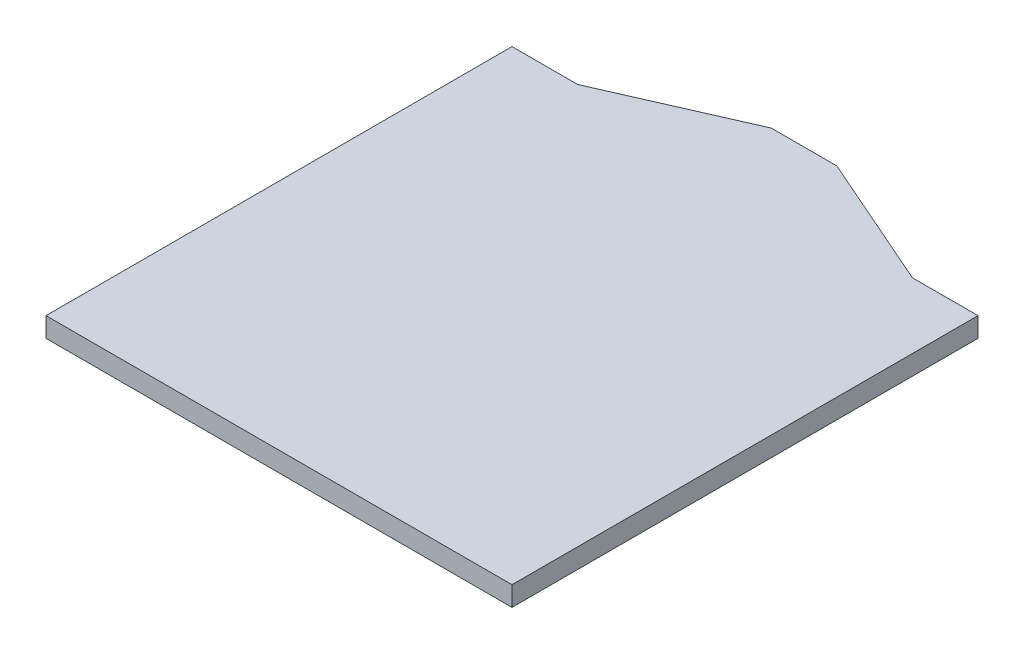
ISO-10303-21;
HEADER;
FILE_DESCRIPTION(('STEP AP214'),'2;1');
FILE_NAME('part.step','',(''),(''),'','','');
FILE_SCHEMA(('AUTOMOTIVE_DESIGN { 1 0 10303 214 1 1 1 1 }'));
ENDSEC;
DATA;
#1=APPLICATION_CONTEXT('core data for automotive mechanical design processes');
#2=APPLICATION_PROTOCOL_DEFINITION('international standard','automotive_design',2000,#1);
#3=PRODUCT_CONTEXT('',#1,'mechanical');
#4=PRODUCT('Part','Part','',(#3));
#5=PRODUCT_RELATED_PRODUCT_CATEGORY('part','',(#4));
#6=PRODUCT_DEFINITION_FORMATION('','',#4);
#7=PRODUCT_DEFINITION_CONTEXT('part definition',#1,'design');
#8=PRODUCT_DEFINITION('design','',#6,#7);
#9=PRODUCT_DEFINITION_SHAPE('','',#8);
#10=(LENGTH_UNIT() NAMED_UNIT(*) SI_UNIT(.MILLI.,.METRE.));
#11=(NAMED_UNIT(*) PLANE_ANGLE_UNIT() SI_UNIT($,.RADIAN.));
#12=(NAMED_UNIT(*) SI_UNIT($,.STERADIAN.) SOLID_ANGLE_UNIT());
#13=UNCERTAINTY_MEASURE_WITH_UNIT(LENGTH_MEASURE(1.E-05),#10,'distance_accuracy_value','');
#14=(GEOMETRIC_REPRESENTATION_CONTEXT(3) GLOBAL_UNCERTAINTY_ASSIGNED_CONTEXT((#13)) GLOBAL_UNIT_ASSIGNED_CONTEXT((#10,
#11,#12)) REPRESENTATION_CONTEXT('',''));
#15=CARTESIAN_POINT('',(0.,0.,0.));
#16=DIRECTION('',(0.,0.,1.));
#17=DIRECTION('',(1.,0.,0.));
#18=AXIS2_PLACEMENT_3D('',#15,#16,#17);
#19=CARTESIAN_POINT('',(17.1875311720698,3.,-39.1493765586035));
#20=DIRECTION('',(0.401990062035199,0.,-0.915644030191284));
#21=DIRECTION('',(-0.915644030191284,0.,-0.401990062035199));
#22=AXIS2_PLACEMENT_3D('',#19,#20,#21);
#23=PLANE('',#22);
#24=DIRECTION('',(0.915644030191284,0.,0.401990062035199));
#25=VECTOR('',#24,1.);
#26=CARTESIAN_POINT('',(17.1875311720698,0.,-39.1493765586035));
#27=LINE('',#26,#25);
#28=CARTESIAN_POINT('',(5.,0.,-44.5));
#29=VERTEX_POINT('',#28);
#30=CARTESIAN_POINT('',(25.5,0.,-35.5));
#31=VERTEX_POINT('',#30);
#32=EDGE_CURVE('E138',#29,#31,#27,.T.);
#33=ORIENTED_EDGE('',*,*,#32,.F.);
#34=DIRECTION('',(0.,-1.,0.));
#35=VECTOR('',#34,1.);
#36=CARTESIAN_POINT('',(5.,3.,-44.5));
#37=LINE('',#36,#35);
#38=CARTESIAN_POINT('',(5.,3.,-44.5));
#39=VERTEX_POINT('',#38);
#40=EDGE_CURVE('E11',#39,#29,#37,.T.);
#41=ORIENTED_EDGE('',*,*,#40,.F.);
#42=DIRECTION('',(0.915644030191284,0.,0.401990062035199));
#43=VECTOR('',#42,1.);
#44=CARTESIAN_POINT('',(17.1875311720698,3.,-39.1493765586035));
#45=LINE('',#44,#43);
#46=CARTESIAN_POINT('',(25.5,3.,-35.5));
#47=VERTEX_POINT('',#46);
#48=EDGE_CURVE('E197',#39,#47,#45,.T.);
#49=ORIENTED_EDGE('',*,*,#48,.T.);
#50=DIRECTION('',(0.,-1.,0.));
#51=VECTOR('',#50,1.);
#52=CARTESIAN_POINT('',(25.5,3.,-35.5));
#53=LINE('',#52,#51);
#54=EDGE_CURVE('E55',#47,#31,#53,.T.);
#55=ORIENTED_EDGE('',*,*,#54,.T.);
#56=EDGE_LOOP('',(#33,#41,#49,#55));
#57=FACE_BOUND('',#56,.T.);
#58=ADVANCED_FACE('F38',(#57),#23,.T.);
#59=CARTESIAN_POINT('',(0.,3.,-44.5));
#60=DIRECTION('',(0.,0.,-1.));
#61=DIRECTION('',(-1.,0.,0.));
#62=AXIS2_PLACEMENT_3D('',#59,#60,#61);
#63=PLANE('',#62);
#64=DIRECTION('',(1.,0.,0.));
#65=VECTOR('',#64,1.);
#66=CARTESIAN_POINT('',(0.,0.,-44.5));
#67=LINE('',#66,#65);
#68=CARTESIAN_POINT('',(-5.,0.,-44.5));
#69=VERTEX_POINT('',#68);
#70=EDGE_CURVE('E141',#69,#29,#67,.T.);
#71=ORIENTED_EDGE('',*,*,#70,.F.);
#72=DIRECTION('',(0.,-1.,0.));
#73=VECTOR('',#72,1.);
#74=CARTESIAN_POINT('',(-5.,3.,-44.5));
#75=LINE('',#74,#73);
#76=CARTESIAN_POINT('',(-5.,3.,-44.5));
#77=VERTEX_POINT('',#76);
#78=EDGE_CURVE('E47',#77,#69,#75,.T.);
#79=ORIENTED_EDGE('',*,*,#78,.F.);
#80=DIRECTION('',(1.,0.,0.));
#81=VECTOR('',#80,1.);
#82=CARTESIAN_POINT('',(0.,3.,-44.5));
#83=LINE('',#82,#81);
#84=EDGE_CURVE('E192',#77,#39,#83,.T.);
#85=ORIENTED_EDGE('',*,*,#84,.T.);
#86=ORIENTED_EDGE('',*,*,#40,.T.);
#87=EDGE_LOOP('',(#71,#79,#85,#86));
#88=FACE_BOUND('',#87,.T.);
#89=ADVANCED_FACE('F184',(#88),#63,.T.);
#90=CARTESIAN_POINT('',(-17.1875311720698,3.,-39.1493765586035));
#91=DIRECTION('',(-0.401990062035198,0.,-0.915644030191284));
#92=DIRECTION('',(-0.915644030191284,0.,0.401990062035198));
#93=AXIS2_PLACEMENT_3D('',#90,#91,#92);
#94=PLANE('',#93);
#95=DIRECTION('',(0.915644030191284,0.,-0.401990062035198));
#96=VECTOR('',#95,1.);
#97=CARTESIAN_POINT('',(-17.1875311720698,0.,-39.1493765586035));
#98=LINE('',#97,#96);
#99=CARTESIAN_POINT('',(-25.5,0.,-35.5));
#100=VERTEX_POINT('',#99);
#101=EDGE_CURVE('E145',#100,#69,#98,.T.);
#102=ORIENTED_EDGE('',*,*,#101,.F.);
#103=DIRECTION('',(0.,-1.,0.));
#104=VECTOR('',#103,1.);
#105=CARTESIAN_POINT('',(-25.5,3.,-35.5));
#106=LINE('',#105,#104);
#107=CARTESIAN_POINT('',(-25.5,3.,-35.5));
#108=VERTEX_POINT('',#107);
#109=EDGE_CURVE('E171',#108,#100,#106,.T.);
#110=ORIENTED_EDGE('',*,*,#109,.F.);
#111=DIRECTION('',(0.915644030191284,0.,-0.401990062035198));
#112=VECTOR('',#111,1.);
#113=CARTESIAN_POINT('',(-17.1875311720698,3.,-39.1493765586035));
#114=LINE('',#113,#112);
#115=EDGE_CURVE('E180',#108,#77,#114,.T.);
#116=ORIENTED_EDGE('',*,*,#115,.T.);
#117=ORIENTED_EDGE('',*,*,#78,.T.);
#118=EDGE_LOOP('',(#102,#110,#116,#117));
#119=FACE_BOUND('',#118,.T.);
#120=ADVANCED_FACE('F178',(#119),#94,.T.);
#121=CARTESIAN_POINT('',(0.,3.,-35.5));
#122=DIRECTION('',(0.,0.,-1.));
#123=DIRECTION('',(-1.,0.,0.));
#124=AXIS2_PLACEMENT_3D('',#121,#122,#123);
#125=PLANE('',#124);
#126=DIRECTION('',(1.,0.,0.));
#127=VECTOR('',#126,1.);
#128=CARTESIAN_POINT('',(0.,0.,-35.5));
#129=LINE('',#128,#127);
#130=CARTESIAN_POINT('',(-35.5,0.,-35.5));
#131=VERTEX_POINT('',#130);
#132=EDGE_CURVE('E149',#131,#100,#129,.T.);
#133=ORIENTED_EDGE('',*,*,#132,.F.);
#134=DIRECTION('',(0.,-1.,0.));
#135=VECTOR('',#134,1.);
#136=CARTESIAN_POINT('',(-35.5,3.,-35.5));
#137=LINE('',#136,#135);
#138=CARTESIAN_POINT('',(-35.5,3.,-35.5));
#139=VERTEX_POINT('',#138);
#140=EDGE_CURVE('E168',#139,#131,#137,.T.);
#141=ORIENTED_EDGE('',*,*,#140,.F.);
#142=DIRECTION('',(1.,0.,0.));
#143=VECTOR('',#142,1.);
#144=CARTESIAN_POINT('',(0.,3.,-35.5));
#145=LINE('',#144,#143);
#146=EDGE_CURVE('E135',#139,#108,#145,.T.);
#147=ORIENTED_EDGE('',*,*,#146,.T.);
#148=ORIENTED_EDGE('',*,*,#109,.T.);
#149=EDGE_LOOP('',(#133,#141,#147,#148));
#150=FACE_BOUND('',#149,.T.);
#151=ADVANCED_FACE('F190',(#150),#125,.T.);
#152=CARTESIAN_POINT('',(-35.5,3.,0.));
#153=DIRECTION('',(1.,0.,0.));
#154=DIRECTION('',(0.,0.,-1.));
#155=AXIS2_PLACEMENT_3D('',#152,#153,#154);
#156=PLANE('',#155);
#157=DIRECTION('',(0.,0.,1.));
#158=VECTOR('',#157,1.);
#159=CARTESIAN_POINT('',(-35.5,0.,0.));
#160=LINE('',#159,#158);
#161=CARTESIAN_POINT('',(-35.5,0.,35.5));
#162=VERTEX_POINT('',#161);
#163=EDGE_CURVE('E153',#131,#162,#160,.T.);
#164=ORIENTED_EDGE('',*,*,#163,.T.);
#165=DIRECTION('',(0.,-1.,0.));
#166=VECTOR('',#165,1.);
#167=CARTESIAN_POINT('',(-35.5,3.,35.5));
#168=LINE('',#167,#166);
#169=CARTESIAN_POINT('',(-35.5,3.,35.5));
#170=VERTEX_POINT('',#169);
#171=EDGE_CURVE('E127',#170,#162,#168,.T.);
#172=ORIENTED_EDGE('',*,*,#171,.F.);
#173=DIRECTION('',(0.,0.,1.));
#174=VECTOR('',#173,1.);
#175=CARTESIAN_POINT('',(-35.5,3.,0.));
#176=LINE('',#175,#174);
#177=EDGE_CURVE('E113',#139,#170,#176,.T.);
#178=ORIENTED_EDGE('',*,*,#177,.F.);
#179=ORIENTED_EDGE('',*,*,#140,.T.);
#180=EDGE_LOOP('',(#164,#172,#178,#179));
#181=FACE_BOUND('',#180,.T.);
#182=ADVANCED_FACE('F215',(#181),#156,.F.);
#183=CARTESIAN_POINT('',(0.,3.,35.5));
#184=DIRECTION('',(0.,0.,-1.));
#185=DIRECTION('',(-1.,0.,0.));
#186=AXIS2_PLACEMENT_3D('',#183,#184,#185);
#187=PLANE('',#186);
#188=DIRECTION('',(1.,0.,0.));
#189=VECTOR('',#188,1.);
#190=CARTESIAN_POINT('',(0.,0.,35.5));
#191=LINE('',#190,#189);
#192=CARTESIAN_POINT('',(35.5,0.,35.5));
#193=VERTEX_POINT('',#192);
#194=EDGE_CURVE('E123',#162,#193,#191,.T.);
#195=ORIENTED_EDGE('',*,*,#194,.T.);
#196=DIRECTION('',(0.,-1.,0.));
#197=VECTOR('',#196,1.);
#198=CARTESIAN_POINT('',(35.5,3.,35.5));
#199=LINE('',#198,#197);
#200=CARTESIAN_POINT('',(35.5,3.,35.5));
#201=VERTEX_POINT('',#200);
#202=EDGE_CURVE('E120',#201,#193,#199,.T.);
#203=ORIENTED_EDGE('',*,*,#202,.F.);
#204=DIRECTION('',(1.,0.,0.));
#205=VECTOR('',#204,1.);
#206=CARTESIAN_POINT('',(0.,3.,35.5));
#207=LINE('',#206,#205);
#208=EDGE_CURVE('E105',#170,#201,#207,.T.);
#209=ORIENTED_EDGE('',*,*,#208,.F.);
#210=ORIENTED_EDGE('',*,*,#171,.T.);
#211=EDGE_LOOP('',(#195,#203,#209,#210));
#212=FACE_BOUND('',#211,.T.);
#213=ADVANCED_FACE('F121',(#212),#187,.F.);
#214=CARTESIAN_POINT('',(35.5,3.,0.));
#215=DIRECTION('',(1.,0.,0.));
#216=DIRECTION('',(0.,0.,-1.));
#217=AXIS2_PLACEMENT_3D('',#214,#215,#216);
#218=PLANE('',#217);
#219=DIRECTION('',(0.,0.,1.));
#220=VECTOR('',#219,1.);
#221=CARTESIAN_POINT('',(35.5,0.,0.));
#222=LINE('',#221,#220);
#223=CARTESIAN_POINT('',(35.5,0.,-35.5));
#224=VERTEX_POINT('',#223);
#225=EDGE_CURVE('E159',#224,#193,#222,.T.);
#226=ORIENTED_EDGE('',*,*,#225,.F.);
#227=DIRECTION('',(0.,-1.,0.));
#228=VECTOR('',#227,1.);
#229=CARTESIAN_POINT('',(35.5,3.,-35.5));
#230=LINE('',#229,#228);
#231=CARTESIAN_POINT('',(35.5,3.,-35.5));
#232=VERTEX_POINT('',#231);
#233=EDGE_CURVE('E80',#232,#224,#230,.T.);
#234=ORIENTED_EDGE('',*,*,#233,.F.);
#235=DIRECTION('',(0.,0.,1.));
#236=VECTOR('',#235,1.);
#237=CARTESIAN_POINT('',(35.5,3.,0.));
#238=LINE('',#237,#236);
#239=EDGE_CURVE('E110',#232,#201,#238,.T.);
#240=ORIENTED_EDGE('',*,*,#239,.T.);
#241=ORIENTED_EDGE('',*,*,#202,.T.);
#242=EDGE_LOOP('',(#226,#234,#240,#241));
#243=FACE_BOUND('',#242,.T.);
#244=ADVANCED_FACE('F129',(#243),#218,.T.);
#245=EDGE_CURVE('E154',#31,#224,#129,.T.);
#246=ORIENTED_EDGE('',*,*,#245,.F.);
#247=ORIENTED_EDGE('',*,*,#54,.F.);
#248=EDGE_CURVE('E131',#47,#232,#145,.T.);
#249=ORIENTED_EDGE('',*,*,#248,.T.);
#250=ORIENTED_EDGE('',*,*,#233,.T.);
#251=EDGE_LOOP('',(#246,#247,#249,#250));
#252=FACE_BOUND('',#251,.T.);
#253=ADVANCED_FACE('F204',(#252),#125,.T.);
#254=CARTESIAN_POINT('',(0.,3.,0.));
#255=DIRECTION('',(0.,1.,0.));
#256=DIRECTION('',(0.,0.,1.));
#257=AXIS2_PLACEMENT_3D('',#254,#255,#256);
#258=PLANE('',#257);
#259=ORIENTED_EDGE('',*,*,#48,.F.);
#260=ORIENTED_EDGE('',*,*,#84,.F.);
#261=ORIENTED_EDGE('',*,*,#115,.F.);
#262=ORIENTED_EDGE('',*,*,#146,.F.);
#263=ORIENTED_EDGE('',*,*,#177,.T.);
#264=ORIENTED_EDGE('',*,*,#208,.T.);
#265=ORIENTED_EDGE('',*,*,#239,.F.);
#266=ORIENTED_EDGE('',*,*,#248,.F.);
#267=EDGE_LOOP('',(#259,#260,#261,#262,#263,#264,#265,#266));
#268=FACE_BOUND('',#267,.T.);
#269=ADVANCED_FACE('F107',(#268),#258,.T.);
#270=CARTESIAN_POINT('',(0.,0.,0.));
#271=DIRECTION('',(0.,1.,0.));
#272=DIRECTION('',(0.,0.,1.));
#273=AXIS2_PLACEMENT_3D('',#270,#271,#272);
#274=PLANE('',#273);
#275=ORIENTED_EDGE('',*,*,#32,.T.);
#276=ORIENTED_EDGE('',*,*,#245,.T.);
#277=ORIENTED_EDGE('',*,*,#225,.T.);
#278=ORIENTED_EDGE('',*,*,#194,.F.);
#279=ORIENTED_EDGE('',*,*,#163,.F.);
#280=ORIENTED_EDGE('',*,*,#132,.T.);
#281=ORIENTED_EDGE('',*,*,#101,.T.);
#282=ORIENTED_EDGE('',*,*,#70,.T.);
#283=EDGE_LOOP('',(#275,#276,#277,#278,#279,#280,#281,#282));
#284=FACE_BOUND('',#283,.T.);
#285=ADVANCED_FACE('F186',(#284),#274,.F.);
#286=CLOSED_SHELL('',(#58,#89,#120,#151,#182,#213,#244,#253,#269,#285));
#287=MANIFOLD_SOLID_BREP('B2',#286);
#288=ADVANCED_BREP_SHAPE_REPRESENTATION('',(#18,#287),#14);
#289=SHAPE_DEFINITION_REPRESENTATION(#9,#288);
ENDSEC;
END-ISO-10303-21;
